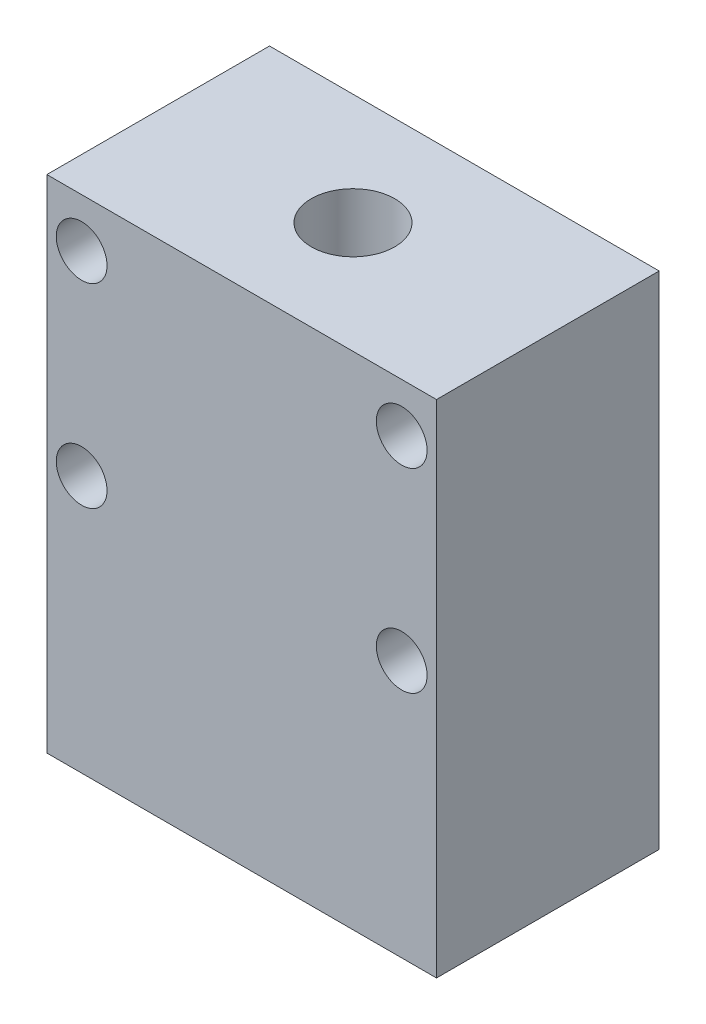
ISO-10303-21;
HEADER;
FILE_DESCRIPTION(('STEP AP214'),'2;1');
FILE_NAME('part.step','',(''),(''),'','','');
FILE_SCHEMA(('AUTOMOTIVE_DESIGN { 1 0 10303 214 1 1 1 1 }'));
ENDSEC;
DATA;
#1=APPLICATION_CONTEXT('core data for automotive mechanical design processes');
#2=APPLICATION_PROTOCOL_DEFINITION('international standard','automotive_design',2000,#1);
#3=PRODUCT_CONTEXT('',#1,'mechanical');
#4=PRODUCT('Part','Part','',(#3));
#5=PRODUCT_RELATED_PRODUCT_CATEGORY('part','',(#4));
#6=PRODUCT_DEFINITION_FORMATION('','',#4);
#7=PRODUCT_DEFINITION_CONTEXT('part definition',#1,'design');
#8=PRODUCT_DEFINITION('design','',#6,#7);
#9=PRODUCT_DEFINITION_SHAPE('','',#8);
#10=(LENGTH_UNIT() NAMED_UNIT(*) SI_UNIT(.MILLI.,.METRE.));
#11=(NAMED_UNIT(*) PLANE_ANGLE_UNIT() SI_UNIT($,.RADIAN.));
#12=(NAMED_UNIT(*) SI_UNIT($,.STERADIAN.) SOLID_ANGLE_UNIT());
#13=UNCERTAINTY_MEASURE_WITH_UNIT(LENGTH_MEASURE(1.E-05),#10,'distance_accuracy_value','');
#14=(GEOMETRIC_REPRESENTATION_CONTEXT(3) GLOBAL_UNCERTAINTY_ASSIGNED_CONTEXT((#13)) GLOBAL_UNIT_ASSIGNED_CONTEXT((#10,
#11,#12)) REPRESENTATION_CONTEXT('',''));
#15=CARTESIAN_POINT('',(0.,0.,0.));
#16=DIRECTION('',(0.,0.,1.));
#17=DIRECTION('',(1.,0.,0.));
#18=AXIS2_PLACEMENT_3D('',#15,#16,#17);
#19=CARTESIAN_POINT('',(-22.225,57.15,12.7));
#20=DIRECTION('',(0.,0.,-1.));
#21=DIRECTION('',(-1.,0.,0.));
#22=AXIS2_PLACEMENT_3D('',#19,#20,#21);
#23=PLANE('',#22);
#24=CARTESIAN_POINT('',(-18.25625,51.5874,12.7));
#25=DIRECTION('',(0.,0.,1.));
#26=DIRECTION('',(1.,0.,0.));
#27=AXIS2_PLACEMENT_3D('',#24,#25,#26);
#28=CIRCLE('',#27,2.8956);
#29=CARTESIAN_POINT('',(-15.36065,51.5874,12.7));
#30=VERTEX_POINT('',#29);
#31=EDGE_CURVE('E150',#30,#30,#28,.T.);
#32=ORIENTED_EDGE('',*,*,#31,.F.);
#33=EDGE_LOOP('',(#32));
#34=FACE_BOUND('',#33,.T.);
#35=DIRECTION('',(1.,0.,0.));
#36=VECTOR('',#35,1.);
#37=CARTESIAN_POINT('',(-22.225,0.,12.7));
#38=LINE('',#37,#36);
#39=CARTESIAN_POINT('',(-22.225,0.,12.7));
#40=VERTEX_POINT('',#39);
#41=CARTESIAN_POINT('',(22.225,0.,12.7));
#42=VERTEX_POINT('',#41);
#43=EDGE_CURVE('E86',#40,#42,#38,.T.);
#44=ORIENTED_EDGE('',*,*,#43,.T.);
#45=DIRECTION('',(0.,-1.,0.));
#46=VECTOR('',#45,1.);
#47=CARTESIAN_POINT('',(22.225,57.15,12.7));
#48=LINE('',#47,#46);
#49=CARTESIAN_POINT('',(22.225,57.15,12.7));
#50=VERTEX_POINT('',#49);
#51=EDGE_CURVE('E106',#50,#42,#48,.T.);
#52=ORIENTED_EDGE('',*,*,#51,.F.);
#53=DIRECTION('',(1.,0.,0.));
#54=VECTOR('',#53,1.);
#55=CARTESIAN_POINT('',(-22.225,57.15,12.7));
#56=LINE('',#55,#54);
#57=CARTESIAN_POINT('',(-22.225,57.15,12.7));
#58=VERTEX_POINT('',#57);
#59=EDGE_CURVE('E63',#58,#50,#56,.T.);
#60=ORIENTED_EDGE('',*,*,#59,.F.);
#61=DIRECTION('',(0.,-1.,0.));
#62=VECTOR('',#61,1.);
#63=CARTESIAN_POINT('',(-22.225,57.15,12.7));
#64=LINE('',#63,#62);
#65=EDGE_CURVE('E103',#58,#40,#64,.T.);
#66=ORIENTED_EDGE('',*,*,#65,.T.);
#67=EDGE_LOOP('',(#44,#52,#60,#66));
#68=FACE_BOUND('',#67,.T.);
#69=CARTESIAN_POINT('',(18.25625,51.5874,12.7));
#70=DIRECTION('',(0.,0.,1.));
#71=DIRECTION('',(1.,0.,0.));
#72=AXIS2_PLACEMENT_3D('',#69,#70,#71);
#73=CIRCLE('',#72,2.8956);
#74=CARTESIAN_POINT('',(21.15185,51.5874,12.7));
#75=VERTEX_POINT('',#74);
#76=EDGE_CURVE('E132',#75,#75,#73,.T.);
#77=ORIENTED_EDGE('',*,*,#76,.F.);
#78=EDGE_LOOP('',(#77));
#79=FACE_BOUND('',#78,.T.);
#80=CARTESIAN_POINT('',(-18.25625,29.3624,12.7));
#81=DIRECTION('',(0.,0.,1.));
#82=DIRECTION('',(1.,0.,0.));
#83=AXIS2_PLACEMENT_3D('',#80,#81,#82);
#84=CIRCLE('',#83,2.8956);
#85=CARTESIAN_POINT('',(-15.36065,29.3624,12.7));
#86=VERTEX_POINT('',#85);
#87=EDGE_CURVE('E138',#86,#86,#84,.T.);
#88=ORIENTED_EDGE('',*,*,#87,.F.);
#89=EDGE_LOOP('',(#88));
#90=FACE_BOUND('',#89,.T.);
#91=CARTESIAN_POINT('',(18.25625,29.3624,12.7));
#92=DIRECTION('',(0.,0.,1.));
#93=DIRECTION('',(1.,0.,0.));
#94=AXIS2_PLACEMENT_3D('',#91,#92,#93);
#95=CIRCLE('',#94,2.8956);
#96=CARTESIAN_POINT('',(21.15185,29.3624,12.7));
#97=VERTEX_POINT('',#96);
#98=EDGE_CURVE('E144',#97,#97,#95,.T.);
#99=ORIENTED_EDGE('',*,*,#98,.F.);
#100=EDGE_LOOP('',(#99));
#101=FACE_BOUND('',#100,.T.);
#102=ADVANCED_FACE('F46',(#34,#68,#79,#90,#101),#23,.F.);
#103=CARTESIAN_POINT('',(22.225,57.15,-12.7));
#104=DIRECTION('',(-1.,0.,0.));
#105=DIRECTION('',(0.,0.,1.));
#106=AXIS2_PLACEMENT_3D('',#103,#104,#105);
#107=PLANE('',#106);
#108=DIRECTION('',(0.,0.,-1.));
#109=VECTOR('',#108,1.);
#110=CARTESIAN_POINT('',(22.225,0.,-12.7));
#111=LINE('',#110,#109);
#112=CARTESIAN_POINT('',(22.225,0.,-12.7));
#113=VERTEX_POINT('',#112);
#114=EDGE_CURVE('E110',#42,#113,#111,.T.);
#115=ORIENTED_EDGE('',*,*,#114,.T.);
#116=DIRECTION('',(0.,-1.,0.));
#117=VECTOR('',#116,1.);
#118=CARTESIAN_POINT('',(22.225,57.15,-12.7));
#119=LINE('',#118,#117);
#120=CARTESIAN_POINT('',(22.225,57.15,-12.7));
#121=VERTEX_POINT('',#120);
#122=EDGE_CURVE('E13',#121,#113,#119,.T.);
#123=ORIENTED_EDGE('',*,*,#122,.F.);
#124=DIRECTION('',(0.,0.,-1.));
#125=VECTOR('',#124,1.);
#126=CARTESIAN_POINT('',(22.225,57.15,-12.7));
#127=LINE('',#126,#125);
#128=EDGE_CURVE('E98',#50,#121,#127,.T.);
#129=ORIENTED_EDGE('',*,*,#128,.F.);
#130=ORIENTED_EDGE('',*,*,#51,.T.);
#131=EDGE_LOOP('',(#115,#123,#129,#130));
#132=FACE_BOUND('',#131,.T.);
#133=ADVANCED_FACE('F48',(#132),#107,.F.);
#134=CARTESIAN_POINT('',(-22.225,57.15,-12.7));
#135=DIRECTION('',(0.,0.,1.));
#136=DIRECTION('',(1.,0.,0.));
#137=AXIS2_PLACEMENT_3D('',#134,#135,#136);
#138=PLANE('',#137);
#139=CARTESIAN_POINT('',(-18.25625,51.5874,-12.7));
#140=DIRECTION('',(0.,0.,1.));
#141=DIRECTION('',(1.,0.,0.));
#142=AXIS2_PLACEMENT_3D('',#139,#140,#141);
#143=CIRCLE('',#142,2.8956);
#144=CARTESIAN_POINT('',(-15.36065,51.5874,-12.7));
#145=VERTEX_POINT('',#144);
#146=EDGE_CURVE('E147',#145,#145,#143,.T.);
#147=ORIENTED_EDGE('',*,*,#146,.T.);
#148=EDGE_LOOP('',(#147));
#149=FACE_BOUND('',#148,.T.);
#150=CARTESIAN_POINT('',(18.25625,29.3624,-12.7));
#151=DIRECTION('',(0.,0.,1.));
#152=DIRECTION('',(1.,0.,0.));
#153=AXIS2_PLACEMENT_3D('',#150,#151,#152);
#154=CIRCLE('',#153,2.8956);
#155=CARTESIAN_POINT('',(21.15185,29.3624,-12.7));
#156=VERTEX_POINT('',#155);
#157=EDGE_CURVE('E141',#156,#156,#154,.T.);
#158=ORIENTED_EDGE('',*,*,#157,.T.);
#159=EDGE_LOOP('',(#158));
#160=FACE_BOUND('',#159,.T.);
#161=CARTESIAN_POINT('',(-18.25625,29.3624,-12.7));
#162=DIRECTION('',(0.,0.,1.));
#163=DIRECTION('',(1.,0.,0.));
#164=AXIS2_PLACEMENT_3D('',#161,#162,#163);
#165=CIRCLE('',#164,2.8956);
#166=CARTESIAN_POINT('',(-15.36065,29.3624,-12.7));
#167=VERTEX_POINT('',#166);
#168=EDGE_CURVE('E135',#167,#167,#165,.T.);
#169=ORIENTED_EDGE('',*,*,#168,.T.);
#170=EDGE_LOOP('',(#169));
#171=FACE_BOUND('',#170,.T.);
#172=CARTESIAN_POINT('',(18.25625,51.5874,-12.7));
#173=DIRECTION('',(0.,0.,1.));
#174=DIRECTION('',(1.,0.,0.));
#175=AXIS2_PLACEMENT_3D('',#172,#173,#174);
#176=CIRCLE('',#175,2.8956);
#177=CARTESIAN_POINT('',(21.15185,51.5874,-12.7));
#178=VERTEX_POINT('',#177);
#179=EDGE_CURVE('E129',#178,#178,#176,.T.);
#180=ORIENTED_EDGE('',*,*,#179,.T.);
#181=EDGE_LOOP('',(#180));
#182=FACE_BOUND('',#181,.T.);
#183=DIRECTION('',(-1.,0.,0.));
#184=VECTOR('',#183,1.);
#185=CARTESIAN_POINT('',(-22.225,0.,-12.7));
#186=LINE('',#185,#184);
#187=CARTESIAN_POINT('',(-22.225,0.,-12.7));
#188=VERTEX_POINT('',#187);
#189=EDGE_CURVE('E102',#113,#188,#186,.T.);
#190=ORIENTED_EDGE('',*,*,#189,.T.);
#191=DIRECTION('',(0.,-1.,0.));
#192=VECTOR('',#191,1.);
#193=CARTESIAN_POINT('',(-22.225,57.15,-12.7));
#194=LINE('',#193,#192);
#195=CARTESIAN_POINT('',(-22.225,57.15,-12.7));
#196=VERTEX_POINT('',#195);
#197=EDGE_CURVE('E55',#196,#188,#194,.T.);
#198=ORIENTED_EDGE('',*,*,#197,.F.);
#199=DIRECTION('',(-1.,0.,0.));
#200=VECTOR('',#199,1.);
#201=CARTESIAN_POINT('',(-22.225,57.15,-12.7));
#202=LINE('',#201,#200);
#203=EDGE_CURVE('E93',#121,#196,#202,.T.);
#204=ORIENTED_EDGE('',*,*,#203,.F.);
#205=ORIENTED_EDGE('',*,*,#122,.T.);
#206=EDGE_LOOP('',(#190,#198,#204,#205));
#207=FACE_BOUND('',#206,.T.);
#208=ADVANCED_FACE('F101',(#149,#160,#171,#182,#207),#138,.F.);
#209=CARTESIAN_POINT('',(-22.225,57.15,-12.7));
#210=DIRECTION('',(1.,0.,0.));
#211=DIRECTION('',(0.,0.,-1.));
#212=AXIS2_PLACEMENT_3D('',#209,#210,#211);
#213=PLANE('',#212);
#214=DIRECTION('',(0.,0.,1.));
#215=VECTOR('',#214,1.);
#216=CARTESIAN_POINT('',(-22.225,0.,-12.7));
#217=LINE('',#216,#215);
#218=EDGE_CURVE('E80',#188,#40,#217,.T.);
#219=ORIENTED_EDGE('',*,*,#218,.T.);
#220=ORIENTED_EDGE('',*,*,#65,.F.);
#221=DIRECTION('',(0.,0.,1.));
#222=VECTOR('',#221,1.);
#223=CARTESIAN_POINT('',(-22.225,57.15,-12.7));
#224=LINE('',#223,#222);
#225=EDGE_CURVE('E96',#196,#58,#224,.T.);
#226=ORIENTED_EDGE('',*,*,#225,.F.);
#227=ORIENTED_EDGE('',*,*,#197,.T.);
#228=EDGE_LOOP('',(#219,#220,#226,#227));
#229=FACE_BOUND('',#228,.T.);
#230=ADVANCED_FACE('F104',(#229),#213,.F.);
#231=CARTESIAN_POINT('',(0.,57.15,0.));
#232=DIRECTION('',(0.,1.,0.));
#233=DIRECTION('',(0.,0.,1.));
#234=AXIS2_PLACEMENT_3D('',#231,#232,#233);
#235=PLANE('',#234);
#236=CARTESIAN_POINT('',(0.,57.15,0.));
#237=DIRECTION('',(0.,1.,0.));
#238=DIRECTION('',(0.,0.,1.));
#239=AXIS2_PLACEMENT_3D('',#236,#237,#238);
#240=CIRCLE('',#239,4.7625);
#241=CARTESIAN_POINT('',(0.,57.15,4.7625));
#242=VERTEX_POINT('',#241);
#243=EDGE_CURVE('E126',#242,#242,#240,.T.);
#244=ORIENTED_EDGE('',*,*,#243,.F.);
#245=EDGE_LOOP('',(#244));
#246=FACE_BOUND('',#245,.T.);
#247=ORIENTED_EDGE('',*,*,#128,.T.);
#248=ORIENTED_EDGE('',*,*,#203,.T.);
#249=ORIENTED_EDGE('',*,*,#225,.T.);
#250=ORIENTED_EDGE('',*,*,#59,.T.);
#251=EDGE_LOOP('',(#247,#248,#249,#250));
#252=FACE_BOUND('',#251,.T.);
#253=ADVANCED_FACE('F94',(#246,#252),#235,.T.);
#254=CARTESIAN_POINT('',(0.,0.,0.));
#255=DIRECTION('',(0.,1.,0.));
#256=DIRECTION('',(0.,0.,1.));
#257=AXIS2_PLACEMENT_3D('',#254,#255,#256);
#258=PLANE('',#257);
#259=CARTESIAN_POINT('',(0.,0.,0.));
#260=DIRECTION('',(0.,1.,0.));
#261=DIRECTION('',(0.,0.,1.));
#262=AXIS2_PLACEMENT_3D('',#259,#260,#261);
#263=CIRCLE('',#262,4.7625);
#264=CARTESIAN_POINT('',(0.,0.,4.7625));
#265=VERTEX_POINT('',#264);
#266=EDGE_CURVE('E113',#265,#265,#263,.F.);
#267=ORIENTED_EDGE('',*,*,#266,.F.);
#268=EDGE_LOOP('',(#267));
#269=FACE_BOUND('',#268,.T.);
#270=ORIENTED_EDGE('',*,*,#114,.F.);
#271=ORIENTED_EDGE('',*,*,#43,.F.);
#272=ORIENTED_EDGE('',*,*,#218,.F.);
#273=ORIENTED_EDGE('',*,*,#189,.F.);
#274=EDGE_LOOP('',(#270,#271,#272,#273));
#275=FACE_BOUND('',#274,.T.);
#276=ADVANCED_FACE('F121',(#269,#275),#258,.F.);
#277=CARTESIAN_POINT('',(0.,-0.001000000000001,0.));
#278=DIRECTION('',(0.,1.,0.));
#279=DIRECTION('',(0.,0.,1.));
#280=AXIS2_PLACEMENT_3D('',#277,#278,#279);
#281=CYLINDRICAL_SURFACE('',#280,4.7625);
#282=ORIENTED_EDGE('',*,*,#243,.T.);
#283=EDGE_LOOP('',(#282));
#284=FACE_BOUND('',#283,.T.);
#285=ORIENTED_EDGE('',*,*,#266,.T.);
#286=EDGE_LOOP('',(#285));
#287=FACE_BOUND('',#286,.T.);
#288=ADVANCED_FACE('F181',(#284,#287),#281,.F.);
#289=CARTESIAN_POINT('',(18.25625,51.5874,12.7));
#290=DIRECTION('',(0.,0.,1.));
#291=DIRECTION('',(1.,0.,0.));
#292=AXIS2_PLACEMENT_3D('',#289,#290,#291);
#293=CYLINDRICAL_SURFACE('',#292,2.8956);
#294=ORIENTED_EDGE('',*,*,#179,.F.);
#295=EDGE_LOOP('',(#294));
#296=FACE_BOUND('',#295,.T.);
#297=ORIENTED_EDGE('',*,*,#76,.T.);
#298=EDGE_LOOP('',(#297));
#299=FACE_BOUND('',#298,.T.);
#300=ADVANCED_FACE('F177',(#296,#299),#293,.F.);
#301=CARTESIAN_POINT('',(-18.25625,29.3624,12.7));
#302=DIRECTION('',(0.,0.,1.));
#303=DIRECTION('',(1.,0.,0.));
#304=AXIS2_PLACEMENT_3D('',#301,#302,#303);
#305=CYLINDRICAL_SURFACE('',#304,2.8956);
#306=ORIENTED_EDGE('',*,*,#168,.F.);
#307=EDGE_LOOP('',(#306));
#308=FACE_BOUND('',#307,.T.);
#309=ORIENTED_EDGE('',*,*,#87,.T.);
#310=EDGE_LOOP('',(#309));
#311=FACE_BOUND('',#310,.T.);
#312=ADVANCED_FACE('F180',(#308,#311),#305,.F.);
#313=CARTESIAN_POINT('',(18.25625,29.3624,12.7));
#314=DIRECTION('',(0.,0.,1.));
#315=DIRECTION('',(1.,0.,0.));
#316=AXIS2_PLACEMENT_3D('',#313,#314,#315);
#317=CYLINDRICAL_SURFACE('',#316,2.8956);
#318=ORIENTED_EDGE('',*,*,#157,.F.);
#319=EDGE_LOOP('',(#318));
#320=FACE_BOUND('',#319,.T.);
#321=ORIENTED_EDGE('',*,*,#98,.T.);
#322=EDGE_LOOP('',(#321));
#323=FACE_BOUND('',#322,.T.);
#324=ADVANCED_FACE('F189',(#320,#323),#317,.F.);
#325=CARTESIAN_POINT('',(-18.25625,51.5874,12.7));
#326=DIRECTION('',(0.,0.,1.));
#327=DIRECTION('',(1.,0.,0.));
#328=AXIS2_PLACEMENT_3D('',#325,#326,#327);
#329=CYLINDRICAL_SURFACE('',#328,2.8956);
#330=ORIENTED_EDGE('',*,*,#146,.F.);
#331=EDGE_LOOP('',(#330));
#332=FACE_BOUND('',#331,.T.);
#333=ORIENTED_EDGE('',*,*,#31,.T.);
#334=EDGE_LOOP('',(#333));
#335=FACE_BOUND('',#334,.T.);
#336=ADVANCED_FACE('F154',(#332,#335),#329,.F.);
#337=CLOSED_SHELL('',(#102,#133,#208,#230,#253,#276,#288,#300,#312,#324,#336));
#338=MANIFOLD_SOLID_BREP('B2',#337);
#339=ADVANCED_BREP_SHAPE_REPRESENTATION('',(#18,#338),#14);
#340=SHAPE_DEFINITION_REPRESENTATION(#9,#339);
ENDSEC;
END-ISO-10303-21;
